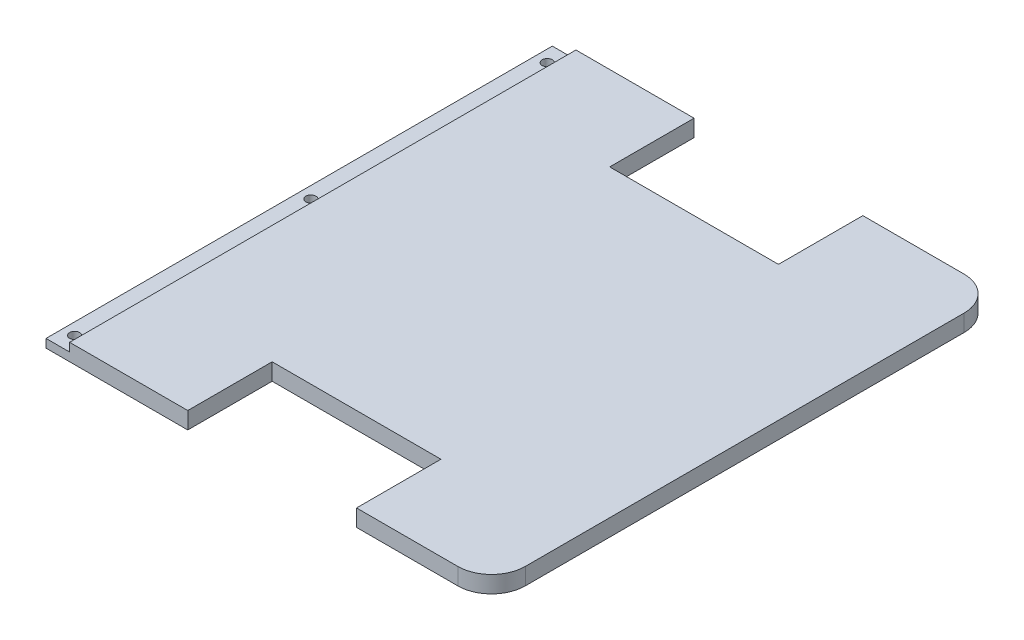
ISO-10303-21;
HEADER;
FILE_DESCRIPTION(('STEP AP214'),'2;1');
FILE_NAME('part.step','',(''),(''),'','','');
FILE_SCHEMA(('AUTOMOTIVE_DESIGN { 1 0 10303 214 1 1 1 1 }'));
ENDSEC;
DATA;
#1=APPLICATION_CONTEXT('core data for automotive mechanical design processes');
#2=APPLICATION_PROTOCOL_DEFINITION('international standard','automotive_design',2000,#1);
#3=PRODUCT_CONTEXT('',#1,'mechanical');
#4=PRODUCT('Part','Part','',(#3));
#5=PRODUCT_RELATED_PRODUCT_CATEGORY('part','',(#4));
#6=PRODUCT_DEFINITION_FORMATION('','',#4);
#7=PRODUCT_DEFINITION_CONTEXT('part definition',#1,'design');
#8=PRODUCT_DEFINITION('design','',#6,#7);
#9=PRODUCT_DEFINITION_SHAPE('','',#8);
#10=(LENGTH_UNIT() NAMED_UNIT(*) SI_UNIT(.MILLI.,.METRE.));
#11=(NAMED_UNIT(*) PLANE_ANGLE_UNIT() SI_UNIT($,.RADIAN.));
#12=(NAMED_UNIT(*) SI_UNIT($,.STERADIAN.) SOLID_ANGLE_UNIT());
#13=UNCERTAINTY_MEASURE_WITH_UNIT(LENGTH_MEASURE(1.E-05),#10,'distance_accuracy_value','');
#14=(GEOMETRIC_REPRESENTATION_CONTEXT(3) GLOBAL_UNCERTAINTY_ASSIGNED_CONTEXT((#13)) GLOBAL_UNIT_ASSIGNED_CONTEXT((#10,
#11,#12)) REPRESENTATION_CONTEXT('',''));
#15=CARTESIAN_POINT('',(0.,0.,0.));
#16=DIRECTION('',(0.,0.,1.));
#17=DIRECTION('',(1.,0.,0.));
#18=AXIS2_PLACEMENT_3D('',#15,#16,#17);
#19=CARTESIAN_POINT('',(-55.7296137339055,5.,92.4892703862661));
#20=DIRECTION('',(0.,0.,-1.));
#21=DIRECTION('',(-1.,0.,0.));
#22=AXIS2_PLACEMENT_3D('',#19,#20,#21);
#23=PLANE('',#22);
#24=DIRECTION('',(1.,0.,0.));
#25=VECTOR('',#24,1.);
#26=CARTESIAN_POINT('',(-27.7296137339055,2.5,92.4892703862661));
#27=LINE('',#26,#25);
#28=CARTESIAN_POINT('',(-27.7296137339056,2.5,92.4892703862661));
#29=VERTEX_POINT('',#28);
#30=CARTESIAN_POINT('',(-20.7296137339055,2.5,92.4892703862661));
#31=VERTEX_POINT('',#30);
#32=EDGE_CURVE('E343',#29,#31,#27,.T.);
#33=ORIENTED_EDGE('',*,*,#32,.F.);
#34=DIRECTION('',(0.,1.,0.));
#35=VECTOR('',#34,1.);
#36=CARTESIAN_POINT('',(-27.7296137339055,0.,92.4892703862661));
#37=LINE('',#36,#35);
#38=CARTESIAN_POINT('',(-27.7296137339055,0.,92.4892703862661));
#39=VERTEX_POINT('',#38);
#40=EDGE_CURVE('E335',#39,#29,#37,.T.);
#41=ORIENTED_EDGE('',*,*,#40,.F.);
#42=DIRECTION('',(1.,0.,0.));
#43=VECTOR('',#42,1.);
#44=CARTESIAN_POINT('',(-55.7296137339055,0.,92.4892703862661));
#45=LINE('',#44,#43);
#46=CARTESIAN_POINT('',(14.2703862660944,0.,92.4892703862661));
#47=VERTEX_POINT('',#46);
#48=EDGE_CURVE('E184',#39,#47,#45,.T.);
#49=ORIENTED_EDGE('',*,*,#48,.T.);
#50=DIRECTION('',(0.,-1.,0.));
#51=VECTOR('',#50,1.);
#52=CARTESIAN_POINT('',(14.2703862660944,5.,92.4892703862661));
#53=LINE('',#52,#51);
#54=CARTESIAN_POINT('',(14.2703862660944,5.,92.4892703862661));
#55=VERTEX_POINT('',#54);
#56=EDGE_CURVE('E11',#55,#47,#53,.T.);
#57=ORIENTED_EDGE('',*,*,#56,.F.);
#58=DIRECTION('',(1.,0.,0.));
#59=VECTOR('',#58,1.);
#60=CARTESIAN_POINT('',(-55.7296137339055,5.,92.4892703862661));
#61=LINE('',#60,#59);
#62=CARTESIAN_POINT('',(-20.7296137339055,5.,92.4892703862661));
#63=VERTEX_POINT('',#62);
#64=EDGE_CURVE('E121',#63,#55,#61,.T.);
#65=ORIENTED_EDGE('',*,*,#64,.F.);
#66=DIRECTION('',(0.,1.,0.));
#67=VECTOR('',#66,1.);
#68=CARTESIAN_POINT('',(-20.7296137339055,2.5,92.4892703862661));
#69=LINE('',#68,#67);
#70=EDGE_CURVE('E188',#31,#63,#69,.T.);
#71=ORIENTED_EDGE('',*,*,#70,.F.);
#72=EDGE_LOOP('',(#33,#41,#49,#57,#65,#71));
#73=FACE_BOUND('',#72,.T.);
#74=ADVANCED_FACE('F44',(#73),#23,.F.);
#75=CARTESIAN_POINT('',(14.2703862660944,5.,67.4892703862661));
#76=DIRECTION('',(-1.,0.,0.));
#77=DIRECTION('',(0.,0.,1.));
#78=AXIS2_PLACEMENT_3D('',#75,#76,#77);
#79=PLANE('',#78);
#80=DIRECTION('',(0.,0.,-1.));
#81=VECTOR('',#80,1.);
#82=CARTESIAN_POINT('',(14.2703862660944,0.,67.4892703862661));
#83=LINE('',#82,#81);
#84=CARTESIAN_POINT('',(14.2703862660944,0.,67.4892703862661));
#85=VERTEX_POINT('',#84);
#86=EDGE_CURVE('E187',#47,#85,#83,.T.);
#87=ORIENTED_EDGE('',*,*,#86,.T.);
#88=DIRECTION('',(0.,-1.,0.));
#89=VECTOR('',#88,1.);
#90=CARTESIAN_POINT('',(14.2703862660944,5.,67.4892703862661));
#91=LINE('',#90,#89);
#92=CARTESIAN_POINT('',(14.2703862660944,5.,67.4892703862661));
#93=VERTEX_POINT('',#92);
#94=EDGE_CURVE('E52',#93,#85,#91,.T.);
#95=ORIENTED_EDGE('',*,*,#94,.F.);
#96=DIRECTION('',(0.,0.,-1.));
#97=VECTOR('',#96,1.);
#98=CARTESIAN_POINT('',(14.2703862660944,5.,67.4892703862661));
#99=LINE('',#98,#97);
#100=EDGE_CURVE('E376',#55,#93,#99,.T.);
#101=ORIENTED_EDGE('',*,*,#100,.F.);
#102=ORIENTED_EDGE('',*,*,#56,.T.);
#103=EDGE_LOOP('',(#87,#95,#101,#102));
#104=FACE_BOUND('',#103,.T.);
#105=ADVANCED_FACE('F379',(#104),#79,.F.);
#106=CARTESIAN_POINT('',(14.2703862660944,5.,67.4892703862661));
#107=DIRECTION('',(0.,0.,-1.));
#108=DIRECTION('',(-1.,0.,0.));
#109=AXIS2_PLACEMENT_3D('',#106,#107,#108);
#110=PLANE('',#109);
#111=DIRECTION('',(1.,0.,0.));
#112=VECTOR('',#111,1.);
#113=CARTESIAN_POINT('',(14.2703862660944,0.,67.4892703862661));
#114=LINE('',#113,#112);
#115=CARTESIAN_POINT('',(64.2703862660944,0.,67.4892703862661));
#116=VERTEX_POINT('',#115);
#117=EDGE_CURVE('E191',#85,#116,#114,.T.);
#118=ORIENTED_EDGE('',*,*,#117,.T.);
#119=DIRECTION('',(0.,-1.,0.));
#120=VECTOR('',#119,1.);
#121=CARTESIAN_POINT('',(64.2703862660944,5.,67.4892703862661));
#122=LINE('',#121,#120);
#123=CARTESIAN_POINT('',(64.2703862660944,5.,67.4892703862661));
#124=VERTEX_POINT('',#123);
#125=EDGE_CURVE('E249',#124,#116,#122,.T.);
#126=ORIENTED_EDGE('',*,*,#125,.F.);
#127=DIRECTION('',(1.,0.,0.));
#128=VECTOR('',#127,1.);
#129=CARTESIAN_POINT('',(14.2703862660944,5.,67.4892703862661));
#130=LINE('',#129,#128);
#131=EDGE_CURVE('E260',#93,#124,#130,.T.);
#132=ORIENTED_EDGE('',*,*,#131,.F.);
#133=ORIENTED_EDGE('',*,*,#94,.T.);
#134=EDGE_LOOP('',(#118,#126,#132,#133));
#135=FACE_BOUND('',#134,.T.);
#136=ADVANCED_FACE('F258',(#135),#110,.F.);
#137=CARTESIAN_POINT('',(64.2703862660944,5.,67.4892703862661));
#138=DIRECTION('',(1.,0.,0.));
#139=DIRECTION('',(0.,0.,-1.));
#140=AXIS2_PLACEMENT_3D('',#137,#138,#139);
#141=PLANE('',#140);
#142=DIRECTION('',(0.,0.,1.));
#143=VECTOR('',#142,1.);
#144=CARTESIAN_POINT('',(64.2703862660944,0.,67.4892703862661));
#145=LINE('',#144,#143);
#146=CARTESIAN_POINT('',(64.2703862660944,0.,92.4892703862661));
#147=VERTEX_POINT('',#146);
#148=EDGE_CURVE('E194',#116,#147,#145,.T.);
#149=ORIENTED_EDGE('',*,*,#148,.T.);
#150=DIRECTION('',(0.,-1.,0.));
#151=VECTOR('',#150,1.);
#152=CARTESIAN_POINT('',(64.2703862660944,5.,92.4892703862661));
#153=LINE('',#152,#151);
#154=CARTESIAN_POINT('',(64.2703862660944,5.,92.4892703862661));
#155=VERTEX_POINT('',#154);
#156=EDGE_CURVE('E245',#155,#147,#153,.T.);
#157=ORIENTED_EDGE('',*,*,#156,.F.);
#158=DIRECTION('',(0.,0.,1.));
#159=VECTOR('',#158,1.);
#160=CARTESIAN_POINT('',(64.2703862660944,5.,67.4892703862661));
#161=LINE('',#160,#159);
#162=EDGE_CURVE('E282',#124,#155,#161,.T.);
#163=ORIENTED_EDGE('',*,*,#162,.F.);
#164=ORIENTED_EDGE('',*,*,#125,.T.);
#165=EDGE_LOOP('',(#149,#157,#163,#164));
#166=FACE_BOUND('',#165,.T.);
#167=ADVANCED_FACE('F272',(#166),#141,.F.);
#168=CARTESIAN_POINT('',(64.2703862660944,5.,92.4892703862661));
#169=DIRECTION('',(0.,0.,-1.));
#170=DIRECTION('',(-1.,0.,0.));
#171=AXIS2_PLACEMENT_3D('',#168,#169,#170);
#172=PLANE('',#171);
#173=DIRECTION('',(1.,0.,0.));
#174=VECTOR('',#173,1.);
#175=CARTESIAN_POINT('',(64.2703862660944,0.,92.4892703862661));
#176=LINE('',#175,#174);
#177=CARTESIAN_POINT('',(94.2703862660943,0.,92.4892703862661));
#178=VERTEX_POINT('',#177);
#179=EDGE_CURVE('E197',#147,#178,#176,.T.);
#180=ORIENTED_EDGE('',*,*,#179,.T.);
#181=DIRECTION('',(0.,-1.,0.));
#182=VECTOR('',#181,1.);
#183=CARTESIAN_POINT('',(94.2703862660943,5.,92.4892703862661));
#184=LINE('',#183,#182);
#185=CARTESIAN_POINT('',(94.2703862660943,5.,92.4892703862661));
#186=VERTEX_POINT('',#185);
#187=EDGE_CURVE('E241',#186,#178,#184,.T.);
#188=ORIENTED_EDGE('',*,*,#187,.F.);
#189=DIRECTION('',(1.,0.,0.));
#190=VECTOR('',#189,1.);
#191=CARTESIAN_POINT('',(64.2703862660944,5.,92.4892703862661));
#192=LINE('',#191,#190);
#193=EDGE_CURVE('E278',#155,#186,#192,.T.);
#194=ORIENTED_EDGE('',*,*,#193,.F.);
#195=ORIENTED_EDGE('',*,*,#156,.T.);
#196=EDGE_LOOP('',(#180,#188,#194,#195));
#197=FACE_BOUND('',#196,.T.);
#198=ADVANCED_FACE('F276',(#197),#172,.F.);
#199=CARTESIAN_POINT('',(94.2703862660944,5.,82.4892703862661));
#200=DIRECTION('',(0.,-1.,0.));
#201=DIRECTION('',(0.,0.,-1.));
#202=AXIS2_PLACEMENT_3D('',#199,#200,#201);
#203=CYLINDRICAL_SURFACE('',#202,10.);
#204=CARTESIAN_POINT('',(94.2703862660944,0.,82.4892703862661));
#205=DIRECTION('',(0.,1.,0.));
#206=DIRECTION('',(0.,0.,1.));
#207=AXIS2_PLACEMENT_3D('',#204,#205,#206);
#208=CIRCLE('',#207,10.);
#209=CARTESIAN_POINT('',(104.270386266094,0.,82.489270386266));
#210=VERTEX_POINT('',#209);
#211=EDGE_CURVE('E200',#178,#210,#208,.T.);
#212=ORIENTED_EDGE('',*,*,#211,.T.);
#213=DIRECTION('',(0.,-1.,0.));
#214=VECTOR('',#213,1.);
#215=CARTESIAN_POINT('',(104.270386266094,5.,82.489270386266));
#216=LINE('',#215,#214);
#217=CARTESIAN_POINT('',(104.270386266094,5.,82.489270386266));
#218=VERTEX_POINT('',#217);
#219=EDGE_CURVE('E237',#218,#210,#216,.T.);
#220=ORIENTED_EDGE('',*,*,#219,.F.);
#221=CARTESIAN_POINT('',(94.2703862660944,5.,82.4892703862661));
#222=DIRECTION('',(0.,1.,0.));
#223=DIRECTION('',(0.,0.,1.));
#224=AXIS2_PLACEMENT_3D('',#221,#222,#223);
#225=CIRCLE('',#224,10.);
#226=EDGE_CURVE('E281',#186,#218,#225,.T.);
#227=ORIENTED_EDGE('',*,*,#226,.F.);
#228=ORIENTED_EDGE('',*,*,#187,.T.);
#229=EDGE_LOOP('',(#212,#220,#227,#228));
#230=FACE_BOUND('',#229,.T.);
#231=ADVANCED_FACE('F391',(#230),#203,.T.);
#232=CARTESIAN_POINT('',(104.270386266094,5.,-47.5107296137339));
#233=DIRECTION('',(-1.,0.,0.));
#234=DIRECTION('',(0.,0.,1.));
#235=AXIS2_PLACEMENT_3D('',#232,#233,#234);
#236=PLANE('',#235);
#237=DIRECTION('',(0.,0.,-1.));
#238=VECTOR('',#237,1.);
#239=CARTESIAN_POINT('',(104.270386266094,0.,-47.5107296137339));
#240=LINE('',#239,#238);
#241=CARTESIAN_POINT('',(104.270386266094,0.,-47.5107296137339));
#242=VERTEX_POINT('',#241);
#243=EDGE_CURVE('E203',#210,#242,#240,.T.);
#244=ORIENTED_EDGE('',*,*,#243,.T.);
#245=DIRECTION('',(0.,-1.,0.));
#246=VECTOR('',#245,1.);
#247=CARTESIAN_POINT('',(104.270386266094,5.,-47.5107296137339));
#248=LINE('',#247,#246);
#249=CARTESIAN_POINT('',(104.270386266094,5.,-47.5107296137339));
#250=VERTEX_POINT('',#249);
#251=EDGE_CURVE('E233',#250,#242,#248,.T.);
#252=ORIENTED_EDGE('',*,*,#251,.F.);
#253=DIRECTION('',(0.,0.,-1.));
#254=VECTOR('',#253,1.);
#255=CARTESIAN_POINT('',(104.270386266094,5.,-47.5107296137339));
#256=LINE('',#255,#254);
#257=EDGE_CURVE('E286',#218,#250,#256,.T.);
#258=ORIENTED_EDGE('',*,*,#257,.F.);
#259=ORIENTED_EDGE('',*,*,#219,.T.);
#260=EDGE_LOOP('',(#244,#252,#258,#259));
#261=FACE_BOUND('',#260,.T.);
#262=ADVANCED_FACE('F394',(#261),#236,.F.);
#263=CARTESIAN_POINT('',(94.2703862660944,5.,-47.510729613734));
#264=DIRECTION('',(0.,-1.,0.));
#265=DIRECTION('',(0.,0.,-1.));
#266=AXIS2_PLACEMENT_3D('',#263,#264,#265);
#267=CYLINDRICAL_SURFACE('',#266,10.);
#268=CARTESIAN_POINT('',(94.2703862660944,0.,-47.510729613734));
#269=DIRECTION('',(0.,1.,0.));
#270=DIRECTION('',(0.,0.,-1.));
#271=AXIS2_PLACEMENT_3D('',#268,#269,#270);
#272=CIRCLE('',#271,10.);
#273=CARTESIAN_POINT('',(94.2703862660943,0.,-57.510729613734));
#274=VERTEX_POINT('',#273);
#275=EDGE_CURVE('E206',#242,#274,#272,.T.);
#276=ORIENTED_EDGE('',*,*,#275,.T.);
#277=DIRECTION('',(0.,-1.,0.));
#278=VECTOR('',#277,1.);
#279=CARTESIAN_POINT('',(94.2703862660943,5.,-57.510729613734));
#280=LINE('',#279,#278);
#281=CARTESIAN_POINT('',(94.2703862660943,5.,-57.510729613734));
#282=VERTEX_POINT('',#281);
#283=EDGE_CURVE('E229',#282,#274,#280,.T.);
#284=ORIENTED_EDGE('',*,*,#283,.F.);
#285=CARTESIAN_POINT('',(94.2703862660944,5.,-47.510729613734));
#286=DIRECTION('',(0.,1.,0.));
#287=DIRECTION('',(0.,0.,-1.));
#288=AXIS2_PLACEMENT_3D('',#285,#286,#287);
#289=CIRCLE('',#288,10.);
#290=EDGE_CURVE('E293',#250,#282,#289,.T.);
#291=ORIENTED_EDGE('',*,*,#290,.F.);
#292=ORIENTED_EDGE('',*,*,#251,.T.);
#293=EDGE_LOOP('',(#276,#284,#291,#292));
#294=FACE_BOUND('',#293,.T.);
#295=ADVANCED_FACE('F301',(#294),#267,.T.);
#296=CARTESIAN_POINT('',(64.2703862660944,5.,-57.5107296137339));
#297=DIRECTION('',(0.,0.,1.));
#298=DIRECTION('',(1.,0.,0.));
#299=AXIS2_PLACEMENT_3D('',#296,#297,#298);
#300=PLANE('',#299);
#301=DIRECTION('',(-1.,0.,0.));
#302=VECTOR('',#301,1.);
#303=CARTESIAN_POINT('',(64.2703862660944,0.,-57.5107296137339));
#304=LINE('',#303,#302);
#305=CARTESIAN_POINT('',(64.2703862660944,0.,-57.5107296137339));
#306=VERTEX_POINT('',#305);
#307=EDGE_CURVE('E209',#274,#306,#304,.T.);
#308=ORIENTED_EDGE('',*,*,#307,.T.);
#309=DIRECTION('',(0.,-1.,0.));
#310=VECTOR('',#309,1.);
#311=CARTESIAN_POINT('',(64.2703862660944,5.,-57.5107296137339));
#312=LINE('',#311,#310);
#313=CARTESIAN_POINT('',(64.2703862660944,5.,-57.5107296137339));
#314=VERTEX_POINT('',#313);
#315=EDGE_CURVE('E170',#314,#306,#312,.T.);
#316=ORIENTED_EDGE('',*,*,#315,.F.);
#317=DIRECTION('',(-1.,0.,0.));
#318=VECTOR('',#317,1.);
#319=CARTESIAN_POINT('',(64.2703862660944,5.,-57.5107296137339));
#320=LINE('',#319,#318);
#321=EDGE_CURVE('E156',#282,#314,#320,.T.);
#322=ORIENTED_EDGE('',*,*,#321,.F.);
#323=ORIENTED_EDGE('',*,*,#283,.T.);
#324=EDGE_LOOP('',(#308,#316,#322,#323));
#325=FACE_BOUND('',#324,.T.);
#326=ADVANCED_FACE('F305',(#325),#300,.F.);
#327=CARTESIAN_POINT('',(64.2703862660944,5.,-57.5107296137339));
#328=DIRECTION('',(1.,0.,0.));
#329=DIRECTION('',(0.,0.,-1.));
#330=AXIS2_PLACEMENT_3D('',#327,#328,#329);
#331=PLANE('',#330);
#332=DIRECTION('',(0.,0.,1.));
#333=VECTOR('',#332,1.);
#334=CARTESIAN_POINT('',(64.2703862660944,0.,-57.5107296137339));
#335=LINE('',#334,#333);
#336=CARTESIAN_POINT('',(64.2703862660944,0.,-32.5107296137339));
#337=VERTEX_POINT('',#336);
#338=EDGE_CURVE('E166',#306,#337,#335,.T.);
#339=ORIENTED_EDGE('',*,*,#338,.T.);
#340=DIRECTION('',(0.,-1.,0.));
#341=VECTOR('',#340,1.);
#342=CARTESIAN_POINT('',(64.2703862660944,5.,-32.5107296137339));
#343=LINE('',#342,#341);
#344=CARTESIAN_POINT('',(64.2703862660944,5.,-32.5107296137339));
#345=VERTEX_POINT('',#344);
#346=EDGE_CURVE('E163',#345,#337,#343,.T.);
#347=ORIENTED_EDGE('',*,*,#346,.F.);
#348=DIRECTION('',(0.,0.,1.));
#349=VECTOR('',#348,1.);
#350=CARTESIAN_POINT('',(64.2703862660944,5.,-57.5107296137339));
#351=LINE('',#350,#349);
#352=EDGE_CURVE('E149',#314,#345,#351,.T.);
#353=ORIENTED_EDGE('',*,*,#352,.F.);
#354=ORIENTED_EDGE('',*,*,#315,.T.);
#355=EDGE_LOOP('',(#339,#347,#353,#354));
#356=FACE_BOUND('',#355,.T.);
#357=ADVANCED_FACE('F164',(#356),#331,.F.);
#358=CARTESIAN_POINT('',(14.2703862660944,5.,-32.5107296137339));
#359=DIRECTION('',(0.,0.,1.));
#360=DIRECTION('',(1.,0.,0.));
#361=AXIS2_PLACEMENT_3D('',#358,#359,#360);
#362=PLANE('',#361);
#363=DIRECTION('',(-1.,0.,0.));
#364=VECTOR('',#363,1.);
#365=CARTESIAN_POINT('',(14.2703862660944,0.,-32.5107296137339));
#366=LINE('',#365,#364);
#367=CARTESIAN_POINT('',(14.2703862660944,0.,-32.5107296137339));
#368=VERTEX_POINT('',#367);
#369=EDGE_CURVE('E214',#337,#368,#366,.T.);
#370=ORIENTED_EDGE('',*,*,#369,.T.);
#371=DIRECTION('',(0.,-1.,0.));
#372=VECTOR('',#371,1.);
#373=CARTESIAN_POINT('',(14.2703862660944,5.,-32.5107296137339));
#374=LINE('',#373,#372);
#375=CARTESIAN_POINT('',(14.2703862660944,5.,-32.5107296137339));
#376=VERTEX_POINT('',#375);
#377=EDGE_CURVE('E171',#376,#368,#374,.T.);
#378=ORIENTED_EDGE('',*,*,#377,.F.);
#379=DIRECTION('',(-1.,0.,0.));
#380=VECTOR('',#379,1.);
#381=CARTESIAN_POINT('',(14.2703862660944,5.,-32.5107296137339));
#382=LINE('',#381,#380);
#383=EDGE_CURVE('E153',#345,#376,#382,.T.);
#384=ORIENTED_EDGE('',*,*,#383,.F.);
#385=ORIENTED_EDGE('',*,*,#346,.T.);
#386=EDGE_LOOP('',(#370,#378,#384,#385));
#387=FACE_BOUND('',#386,.T.);
#388=ADVANCED_FACE('F173',(#387),#362,.F.);
#389=CARTESIAN_POINT('',(14.2703862660944,5.,-57.5107296137339));
#390=DIRECTION('',(-1.,0.,0.));
#391=DIRECTION('',(0.,0.,1.));
#392=AXIS2_PLACEMENT_3D('',#389,#390,#391);
#393=PLANE('',#392);
#394=DIRECTION('',(0.,0.,-1.));
#395=VECTOR('',#394,1.);
#396=CARTESIAN_POINT('',(14.2703862660944,0.,-57.5107296137339));
#397=LINE('',#396,#395);
#398=CARTESIAN_POINT('',(14.2703862660944,0.,-57.5107296137339));
#399=VERTEX_POINT('',#398);
#400=EDGE_CURVE('E113',#368,#399,#397,.T.);
#401=ORIENTED_EDGE('',*,*,#400,.T.);
#402=DIRECTION('',(0.,-1.,0.));
#403=VECTOR('',#402,1.);
#404=CARTESIAN_POINT('',(14.2703862660944,5.,-57.5107296137339));
#405=LINE('',#404,#403);
#406=CARTESIAN_POINT('',(14.2703862660944,5.,-57.5107296137339));
#407=VERTEX_POINT('',#406);
#408=EDGE_CURVE('E183',#407,#399,#405,.T.);
#409=ORIENTED_EDGE('',*,*,#408,.F.);
#410=DIRECTION('',(0.,0.,-1.));
#411=VECTOR('',#410,1.);
#412=CARTESIAN_POINT('',(14.2703862660944,5.,-57.5107296137339));
#413=LINE('',#412,#411);
#414=EDGE_CURVE('E68',#376,#407,#413,.T.);
#415=ORIENTED_EDGE('',*,*,#414,.F.);
#416=ORIENTED_EDGE('',*,*,#377,.T.);
#417=EDGE_LOOP('',(#401,#409,#415,#416));
#418=FACE_BOUND('',#417,.T.);
#419=ADVANCED_FACE('F307',(#418),#393,.F.);
#420=CARTESIAN_POINT('',(-55.7296137339055,5.,-57.5107296137339));
#421=DIRECTION('',(0.,0.,1.));
#422=DIRECTION('',(1.,0.,0.));
#423=AXIS2_PLACEMENT_3D('',#420,#421,#422);
#424=PLANE('',#423);
#425=DIRECTION('',(-1.,0.,0.));
#426=VECTOR('',#425,1.);
#427=CARTESIAN_POINT('',(-55.7296137339055,0.,-57.5107296137339));
#428=LINE('',#427,#426);
#429=CARTESIAN_POINT('',(-27.7296137339056,0.,-57.5107296137339));
#430=VERTEX_POINT('',#429);
#431=EDGE_CURVE('E219',#399,#430,#428,.T.);
#432=ORIENTED_EDGE('',*,*,#431,.T.);
#433=DIRECTION('',(0.,-1.,0.));
#434=VECTOR('',#433,1.);
#435=CARTESIAN_POINT('',(-27.7296137339056,0.,-57.5107296137339));
#436=LINE('',#435,#434);
#437=CARTESIAN_POINT('',(-27.7296137339056,2.5,-57.5107296137339));
#438=VERTEX_POINT('',#437);
#439=EDGE_CURVE('E59',#438,#430,#436,.T.);
#440=ORIENTED_EDGE('',*,*,#439,.F.);
#441=DIRECTION('',(-1.,0.,0.));
#442=VECTOR('',#441,1.);
#443=CARTESIAN_POINT('',(-27.7296137339056,2.5,-57.5107296137339));
#444=LINE('',#443,#442);
#445=CARTESIAN_POINT('',(-20.7296137339056,2.5,-57.5107296137339));
#446=VERTEX_POINT('',#445);
#447=EDGE_CURVE('E348',#446,#438,#444,.T.);
#448=ORIENTED_EDGE('',*,*,#447,.F.);
#449=DIRECTION('',(0.,-1.,0.));
#450=VECTOR('',#449,1.);
#451=CARTESIAN_POINT('',(-20.7296137339056,2.5,-57.5107296137339));
#452=LINE('',#451,#450);
#453=CARTESIAN_POINT('',(-20.7296137339056,5.,-57.5107296137339));
#454=VERTEX_POINT('',#453);
#455=EDGE_CURVE('E315',#454,#446,#452,.T.);
#456=ORIENTED_EDGE('',*,*,#455,.F.);
#457=DIRECTION('',(-1.,0.,0.));
#458=VECTOR('',#457,1.);
#459=CARTESIAN_POINT('',(-55.7296137339055,5.,-57.5107296137339));
#460=LINE('',#459,#458);
#461=EDGE_CURVE('E177',#407,#454,#460,.T.);
#462=ORIENTED_EDGE('',*,*,#461,.F.);
#463=ORIENTED_EDGE('',*,*,#408,.T.);
#464=EDGE_LOOP('',(#432,#440,#448,#456,#462,#463));
#465=FACE_BOUND('',#464,.T.);
#466=ADVANCED_FACE('F311',(#465),#424,.F.);
#467=CARTESIAN_POINT('',(94.2703862660944,5.,-47.510729613734));
#468=DIRECTION('',(0.,-1.,0.));
#469=DIRECTION('',(0.,0.,-1.));
#470=AXIS2_PLACEMENT_3D('',#467,#468,#469);
#471=PLANE('',#470);
#472=ORIENTED_EDGE('',*,*,#461,.T.);
#473=DIRECTION('',(0.,0.,-1.));
#474=VECTOR('',#473,1.);
#475=CARTESIAN_POINT('',(-20.7296137339055,5.,217.589230418234));
#476=LINE('',#475,#474);
#477=EDGE_CURVE('E318',#63,#454,#476,.T.);
#478=ORIENTED_EDGE('',*,*,#477,.F.);
#479=ORIENTED_EDGE('',*,*,#64,.T.);
#480=ORIENTED_EDGE('',*,*,#100,.T.);
#481=ORIENTED_EDGE('',*,*,#131,.T.);
#482=ORIENTED_EDGE('',*,*,#162,.T.);
#483=ORIENTED_EDGE('',*,*,#193,.T.);
#484=ORIENTED_EDGE('',*,*,#226,.T.);
#485=ORIENTED_EDGE('',*,*,#257,.T.);
#486=ORIENTED_EDGE('',*,*,#290,.T.);
#487=ORIENTED_EDGE('',*,*,#321,.T.);
#488=ORIENTED_EDGE('',*,*,#352,.T.);
#489=ORIENTED_EDGE('',*,*,#383,.T.);
#490=ORIENTED_EDGE('',*,*,#414,.T.);
#491=EDGE_LOOP('',(#472,#478,#479,#480,#481,#482,#483,#484,#485,#486,#487,#488,#489,#490));
#492=FACE_BOUND('',#491,.T.);
#493=ADVANCED_FACE('F151',(#492),#471,.F.);
#494=CARTESIAN_POINT('',(94.2703862660944,0.,-47.510729613734));
#495=DIRECTION('',(0.,-1.,0.));
#496=DIRECTION('',(0.,0.,-1.));
#497=AXIS2_PLACEMENT_3D('',#494,#495,#496);
#498=PLANE('',#497);
#499=CARTESIAN_POINT('',(-24.2296137339055,0.,87.4892703862661));
#500=DIRECTION('',(0.,1.,0.));
#501=DIRECTION('',(0.,0.,1.));
#502=AXIS2_PLACEMENT_3D('',#499,#500,#501);
#503=CIRCLE('',#502,1.5);
#504=CARTESIAN_POINT('',(-24.2296137339055,0.,88.9892703862661));
#505=VERTEX_POINT('',#504);
#506=EDGE_CURVE('E456',#505,#505,#503,.T.);
#507=ORIENTED_EDGE('',*,*,#506,.T.);
#508=EDGE_LOOP('',(#507));
#509=FACE_BOUND('',#508,.T.);
#510=CARTESIAN_POINT('',(-24.2296137339055,0.,-52.5107296137339));
#511=DIRECTION('',(0.,1.,0.));
#512=DIRECTION('',(0.,0.,1.));
#513=AXIS2_PLACEMENT_3D('',#510,#511,#512);
#514=CIRCLE('',#513,1.5);
#515=CARTESIAN_POINT('',(-24.2296137339055,0.,-51.0107296137339));
#516=VERTEX_POINT('',#515);
#517=EDGE_CURVE('E440',#516,#516,#514,.T.);
#518=ORIENTED_EDGE('',*,*,#517,.T.);
#519=EDGE_LOOP('',(#518));
#520=FACE_BOUND('',#519,.T.);
#521=CARTESIAN_POINT('',(-24.2296137339055,0.,17.4892703862661));
#522=DIRECTION('',(0.,1.,0.));
#523=DIRECTION('',(0.,0.,1.));
#524=AXIS2_PLACEMENT_3D('',#521,#522,#523);
#525=CIRCLE('',#524,1.5);
#526=CARTESIAN_POINT('',(-24.2296137339055,0.,18.9892703862661));
#527=VERTEX_POINT('',#526);
#528=EDGE_CURVE('E363',#527,#527,#525,.T.);
#529=ORIENTED_EDGE('',*,*,#528,.T.);
#530=EDGE_LOOP('',(#529));
#531=FACE_BOUND('',#530,.T.);
#532=DIRECTION('',(0.,0.,-1.));
#533=VECTOR('',#532,1.);
#534=CARTESIAN_POINT('',(-27.7296137339055,0.,217.589230418234));
#535=LINE('',#534,#533);
#536=EDGE_CURVE('E333',#39,#430,#535,.T.);
#537=ORIENTED_EDGE('',*,*,#536,.T.);
#538=ORIENTED_EDGE('',*,*,#431,.F.);
#539=ORIENTED_EDGE('',*,*,#400,.F.);
#540=ORIENTED_EDGE('',*,*,#369,.F.);
#541=ORIENTED_EDGE('',*,*,#338,.F.);
#542=ORIENTED_EDGE('',*,*,#307,.F.);
#543=ORIENTED_EDGE('',*,*,#275,.F.);
#544=ORIENTED_EDGE('',*,*,#243,.F.);
#545=ORIENTED_EDGE('',*,*,#211,.F.);
#546=ORIENTED_EDGE('',*,*,#179,.F.);
#547=ORIENTED_EDGE('',*,*,#148,.F.);
#548=ORIENTED_EDGE('',*,*,#117,.F.);
#549=ORIENTED_EDGE('',*,*,#86,.F.);
#550=ORIENTED_EDGE('',*,*,#48,.F.);
#551=EDGE_LOOP('',(#537,#538,#539,#540,#541,#542,#543,#544,#545,#546,#547,#548,#549,#550));
#552=FACE_BOUND('',#551,.T.);
#553=ADVANCED_FACE('F266',(#509,#520,#531,#552),#498,.T.);
#554=CARTESIAN_POINT('',(-27.7296137339055,0.,217.589230418234));
#555=DIRECTION('',(1.,0.,0.));
#556=DIRECTION('',(0.,0.,-1.));
#557=AXIS2_PLACEMENT_3D('',#554,#555,#556);
#558=PLANE('',#557);
#559=ORIENTED_EDGE('',*,*,#40,.T.);
#560=DIRECTION('',(0.,0.,-1.));
#561=VECTOR('',#560,1.);
#562=CARTESIAN_POINT('',(-27.7296137339055,2.5,217.589230418234));
#563=LINE('',#562,#561);
#564=EDGE_CURVE('E338',#29,#438,#563,.T.);
#565=ORIENTED_EDGE('',*,*,#564,.T.);
#566=ORIENTED_EDGE('',*,*,#439,.T.);
#567=ORIENTED_EDGE('',*,*,#536,.F.);
#568=EDGE_LOOP('',(#559,#565,#566,#567));
#569=FACE_BOUND('',#568,.T.);
#570=ADVANCED_FACE('F337',(#569),#558,.F.);
#571=CARTESIAN_POINT('',(-27.7296137339055,2.5,217.589230418234));
#572=DIRECTION('',(0.,-1.,0.));
#573=DIRECTION('',(0.,0.,-1.));
#574=AXIS2_PLACEMENT_3D('',#571,#572,#573);
#575=PLANE('',#574);
#576=CARTESIAN_POINT('',(-24.2296137339055,2.5,87.4892703862661));
#577=DIRECTION('',(0.,1.,0.));
#578=DIRECTION('',(0.,0.,1.));
#579=AXIS2_PLACEMENT_3D('',#576,#577,#578);
#580=CIRCLE('',#579,1.5);
#581=CARTESIAN_POINT('',(-24.2296137339055,2.5,88.9892703862661));
#582=VERTEX_POINT('',#581);
#583=EDGE_CURVE('E450',#582,#582,#580,.T.);
#584=ORIENTED_EDGE('',*,*,#583,.F.);
#585=EDGE_LOOP('',(#584));
#586=FACE_BOUND('',#585,.T.);
#587=CARTESIAN_POINT('',(-24.2296137339055,2.5,-52.5107296137339));
#588=DIRECTION('',(0.,1.,0.));
#589=DIRECTION('',(0.,0.,1.));
#590=AXIS2_PLACEMENT_3D('',#587,#588,#589);
#591=CIRCLE('',#590,1.5);
#592=CARTESIAN_POINT('',(-24.2296137339055,2.5,-51.0107296137339));
#593=VERTEX_POINT('',#592);
#594=EDGE_CURVE('E443',#593,#593,#591,.T.);
#595=ORIENTED_EDGE('',*,*,#594,.F.);
#596=EDGE_LOOP('',(#595));
#597=FACE_BOUND('',#596,.T.);
#598=CARTESIAN_POINT('',(-24.2296137339055,2.5,17.4892703862661));
#599=DIRECTION('',(0.,1.,0.));
#600=DIRECTION('',(0.,0.,1.));
#601=AXIS2_PLACEMENT_3D('',#598,#599,#600);
#602=CIRCLE('',#601,1.5);
#603=CARTESIAN_POINT('',(-24.2296137339055,2.5,18.9892703862661));
#604=VERTEX_POINT('',#603);
#605=EDGE_CURVE('E358',#604,#604,#602,.T.);
#606=ORIENTED_EDGE('',*,*,#605,.F.);
#607=EDGE_LOOP('',(#606));
#608=FACE_BOUND('',#607,.T.);
#609=ORIENTED_EDGE('',*,*,#32,.T.);
#610=DIRECTION('',(0.,0.,-1.));
#611=VECTOR('',#610,1.);
#612=CARTESIAN_POINT('',(-20.7296137339055,2.5,217.589230418234));
#613=LINE('',#612,#611);
#614=EDGE_CURVE('E350',#31,#446,#613,.T.);
#615=ORIENTED_EDGE('',*,*,#614,.T.);
#616=ORIENTED_EDGE('',*,*,#447,.T.);
#617=ORIENTED_EDGE('',*,*,#564,.F.);
#618=EDGE_LOOP('',(#609,#615,#616,#617));
#619=FACE_BOUND('',#618,.T.);
#620=ADVANCED_FACE('F346',(#586,#597,#608,#619),#575,.F.);
#621=CARTESIAN_POINT('',(-20.7296137339055,2.5,217.589230418234));
#622=DIRECTION('',(1.,0.,0.));
#623=DIRECTION('',(0.,0.,-1.));
#624=AXIS2_PLACEMENT_3D('',#621,#622,#623);
#625=PLANE('',#624);
#626=ORIENTED_EDGE('',*,*,#70,.T.);
#627=ORIENTED_EDGE('',*,*,#477,.T.);
#628=ORIENTED_EDGE('',*,*,#455,.T.);
#629=ORIENTED_EDGE('',*,*,#614,.F.);
#630=EDGE_LOOP('',(#626,#627,#628,#629));
#631=FACE_BOUND('',#630,.T.);
#632=ADVANCED_FACE('F416',(#631),#625,.F.);
#633=CARTESIAN_POINT('',(-24.2296137339055,0.,17.4892703862661));
#634=DIRECTION('',(0.,1.,0.));
#635=DIRECTION('',(0.,0.,1.));
#636=AXIS2_PLACEMENT_3D('',#633,#634,#635);
#637=CYLINDRICAL_SURFACE('',#636,1.5);
#638=ORIENTED_EDGE('',*,*,#528,.F.);
#639=EDGE_LOOP('',(#638));
#640=FACE_BOUND('',#639,.T.);
#641=ORIENTED_EDGE('',*,*,#605,.T.);
#642=EDGE_LOOP('',(#641));
#643=FACE_BOUND('',#642,.T.);
#644=ADVANCED_FACE('F419',(#640,#643),#637,.F.);
#645=CARTESIAN_POINT('',(-24.2296137339055,0.,-52.5107296137339));
#646=DIRECTION('',(0.,1.,0.));
#647=DIRECTION('',(0.,0.,1.));
#648=AXIS2_PLACEMENT_3D('',#645,#646,#647);
#649=CYLINDRICAL_SURFACE('',#648,1.5);
#650=ORIENTED_EDGE('',*,*,#517,.F.);
#651=EDGE_LOOP('',(#650));
#652=FACE_BOUND('',#651,.T.);
#653=ORIENTED_EDGE('',*,*,#594,.T.);
#654=EDGE_LOOP('',(#653));
#655=FACE_BOUND('',#654,.T.);
#656=ADVANCED_FACE('F427',(#652,#655),#649,.F.);
#657=CARTESIAN_POINT('',(-24.2296137339055,0.,87.4892703862661));
#658=DIRECTION('',(0.,1.,0.));
#659=DIRECTION('',(0.,0.,1.));
#660=AXIS2_PLACEMENT_3D('',#657,#658,#659);
#661=CYLINDRICAL_SURFACE('',#660,1.5);
#662=ORIENTED_EDGE('',*,*,#506,.F.);
#663=EDGE_LOOP('',(#662));
#664=FACE_BOUND('',#663,.T.);
#665=ORIENTED_EDGE('',*,*,#583,.T.);
#666=EDGE_LOOP('',(#665));
#667=FACE_BOUND('',#666,.T.);
#668=ADVANCED_FACE('F429',(#664,#667),#661,.F.);
#669=CLOSED_SHELL('',(#74,#105,#136,#167,#198,#231,#262,#295,#326,#357,#388,#419,#466,#493,#553,
#570,#620,#632,#644,#656,#668));
#670=MANIFOLD_SOLID_BREP('B2',#669);
#671=ADVANCED_BREP_SHAPE_REPRESENTATION('',(#18,#670),#14);
#672=SHAPE_DEFINITION_REPRESENTATION(#9,#671);
ENDSEC;
END-ISO-10303-21;
